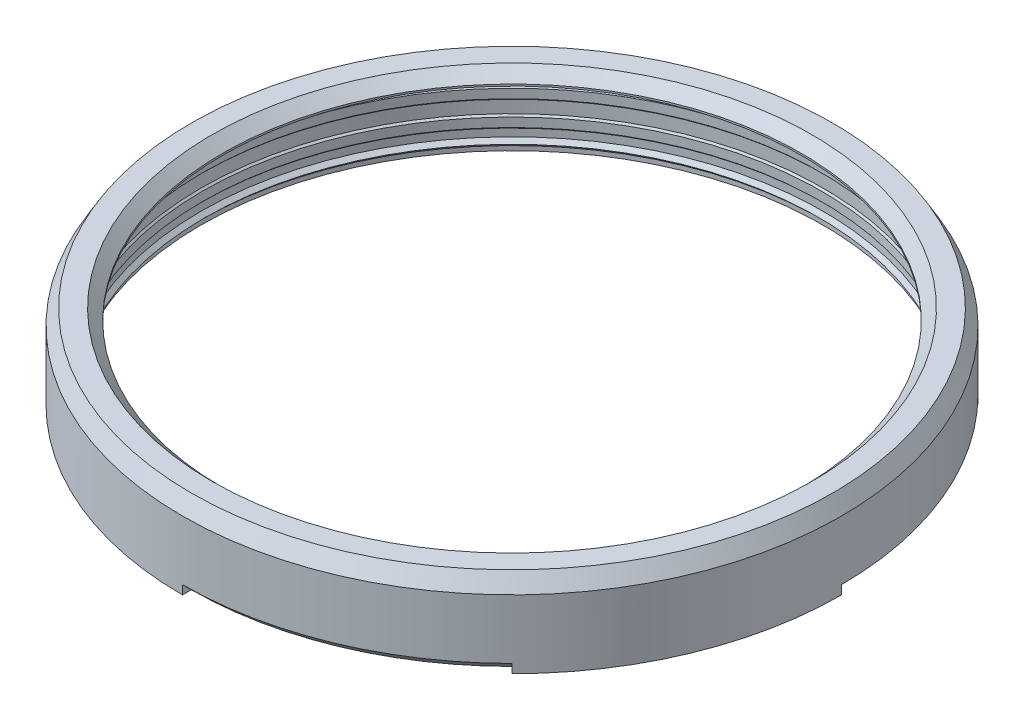
ISO-10303-21;
HEADER;
FILE_DESCRIPTION(('STEP AP214'),'2;1');
FILE_NAME('part.step','',(''),(''),'','','');
FILE_SCHEMA(('AUTOMOTIVE_DESIGN { 1 0 10303 214 1 1 1 1 }'));
ENDSEC;
DATA;
#1=APPLICATION_CONTEXT('core data for automotive mechanical design processes');
#2=APPLICATION_PROTOCOL_DEFINITION('international standard','automotive_design',2000,#1);
#3=PRODUCT_CONTEXT('',#1,'mechanical');
#4=PRODUCT('Part','Part','',(#3));
#5=PRODUCT_RELATED_PRODUCT_CATEGORY('part','',(#4));
#6=PRODUCT_DEFINITION_FORMATION('','',#4);
#7=PRODUCT_DEFINITION_CONTEXT('part definition',#1,'design');
#8=PRODUCT_DEFINITION('design','',#6,#7);
#9=PRODUCT_DEFINITION_SHAPE('','',#8);
#10=(LENGTH_UNIT() NAMED_UNIT(*) SI_UNIT(.MILLI.,.METRE.));
#11=(NAMED_UNIT(*) PLANE_ANGLE_UNIT() SI_UNIT($,.RADIAN.));
#12=(NAMED_UNIT(*) SI_UNIT($,.STERADIAN.) SOLID_ANGLE_UNIT());
#13=UNCERTAINTY_MEASURE_WITH_UNIT(LENGTH_MEASURE(1.E-05),#10,'distance_accuracy_value','');
#14=(GEOMETRIC_REPRESENTATION_CONTEXT(3) GLOBAL_UNCERTAINTY_ASSIGNED_CONTEXT((#13)) GLOBAL_UNIT_ASSIGNED_CONTEXT((#10,
#11,#12)) REPRESENTATION_CONTEXT('',''));
#15=CARTESIAN_POINT('',(0.,0.,0.));
#16=DIRECTION('',(0.,0.,1.));
#17=DIRECTION('',(1.,0.,0.));
#18=AXIS2_PLACEMENT_3D('',#15,#16,#17);
#19=CARTESIAN_POINT('',(0.,-1.39999999999983,0.));
#20=DIRECTION('',(0.,-1.,0.));
#21=DIRECTION('',(1.,0.,0.));
#22=AXIS2_PLACEMENT_3D('',#19,#20,#21);
#23=TOROIDAL_SURFACE('',#22,33.5300000000002,1.39999999999979);
#24=CARTESIAN_POINT('',(0.,-1.39999999999983,0.));
#25=DIRECTION('',(0.,-1.,0.));
#26=DIRECTION('',(1.,0.,0.));
#27=AXIS2_PLACEMENT_3D('',#24,#25,#26);
#28=CIRCLE('',#27,34.93);
#29=CARTESIAN_POINT('',(34.93,-1.39999999999983,0.));
#30=VERTEX_POINT('',#29);
#31=EDGE_CURVE('E261',#30,#30,#28,.T.);
#32=ORIENTED_EDGE('',*,*,#31,.T.);
#33=EDGE_LOOP('',(#32));
#34=FACE_BOUND('',#33,.T.);
#35=CARTESIAN_POINT('',(0.,-0.022502268604415,0.));
#36=DIRECTION('',(0.,-1.,0.));
#37=DIRECTION('',(1.,0.,0.));
#38=AXIS2_PLACEMENT_3D('',#35,#36,#37);
#39=CIRCLE('',#38,33.78);
#40=CARTESIAN_POINT('',(33.78,-0.0225022686044152,0.));
#41=VERTEX_POINT('',#40);
#42=EDGE_CURVE('E43',#41,#41,#39,.F.);
#43=ORIENTED_EDGE('',*,*,#42,.T.);
#44=EDGE_LOOP('',(#43));
#45=FACE_BOUND('',#44,.T.);
#46=ADVANCED_FACE('F38',(#34,#45),#23,.F.);
#47=CARTESIAN_POINT('',(0.,0.,0.));
#48=DIRECTION('',(0.,1.,0.));
#49=DIRECTION('',(0.,0.,1.));
#50=AXIS2_PLACEMENT_3D('',#47,#48,#49);
#51=PLANE('',#50);
#52=CARTESIAN_POINT('',(0.,0.,0.));
#53=DIRECTION('',(0.,1.,0.));
#54=DIRECTION('',(0.,0.,1.));
#55=AXIS2_PLACEMENT_3D('',#52,#53,#54);
#56=CIRCLE('',#55,32.5);
#57=CARTESIAN_POINT('',(0.,0.,32.5));
#58=VERTEX_POINT('',#57);
#59=EDGE_CURVE('E219',#58,#58,#56,.T.);
#60=ORIENTED_EDGE('',*,*,#59,.T.);
#61=EDGE_LOOP('',(#60));
#62=FACE_BOUND('',#61,.T.);
#63=CARTESIAN_POINT('',(0.,0.,0.));
#64=DIRECTION('',(0.,-1.,0.));
#65=DIRECTION('',(0.,0.,-1.));
#66=AXIS2_PLACEMENT_3D('',#63,#64,#65);
#67=CIRCLE('',#66,33.32);
#68=CARTESIAN_POINT('',(0.,0.,-33.32));
#69=VERTEX_POINT('',#68);
#70=EDGE_CURVE('E356',#69,#69,#67,.T.);
#71=ORIENTED_EDGE('',*,*,#70,.T.);
#72=EDGE_LOOP('',(#71));
#73=FACE_BOUND('',#72,.T.);
#74=ADVANCED_FACE('F292',(#62,#73),#51,.F.);
#75=CARTESIAN_POINT('',(0.,2.,0.));
#76=DIRECTION('',(0.,-1.,0.));
#77=DIRECTION('',(0.,0.,-1.));
#78=AXIS2_PLACEMENT_3D('',#75,#76,#77);
#79=CYLINDRICAL_SURFACE('',#78,37.);
#80=CARTESIAN_POINT('',(0.,-0.332000000000053,0.));
#81=DIRECTION('',(0.,1.,0.));
#82=DIRECTION('',(0.,0.,1.));
#83=AXIS2_PLACEMENT_3D('',#80,#81,#82);
#84=CIRCLE('',#83,37.);
#85=CARTESIAN_POINT('',(0.,-0.332000000000053,37.));
#86=VERTEX_POINT('',#85);
#87=EDGE_CURVE('E11',#86,#86,#84,.F.);
#88=ORIENTED_EDGE('',*,*,#87,.T.);
#89=EDGE_LOOP('',(#88));
#90=FACE_BOUND('',#89,.T.);
#91=DIRECTION('',(0.,1.,0.));
#92=VECTOR('',#91,1.);
#93=CARTESIAN_POINT('',(-26.162950903902,-7.99999999999999,-26.1629509039025));
#94=LINE('',#93,#92);
#95=CARTESIAN_POINT('',(-26.162950903902,-7.99999999999999,-26.1629509039025));
#96=VERTEX_POINT('',#95);
#97=CARTESIAN_POINT('',(-26.162950903902,-6.99999999999999,-26.1629509039025));
#98=VERTEX_POINT('',#97);
#99=EDGE_CURVE('E135',#96,#98,#94,.T.);
#100=ORIENTED_EDGE('',*,*,#99,.F.);
#101=CARTESIAN_POINT('',(0.,-7.99999999999999,0.));
#102=DIRECTION('',(0.,-1.,0.));
#103=DIRECTION('',(1.,0.,0.));
#104=AXIS2_PLACEMENT_3D('',#101,#102,#103);
#105=CIRCLE('',#104,36.9999999999999);
#106=CARTESIAN_POINT('',(-36.9999999999999,-7.99999999999999,0.));
#107=VERTEX_POINT('',#106);
#108=EDGE_CURVE('E323',#107,#96,#105,.T.);
#109=ORIENTED_EDGE('',*,*,#108,.F.);
#110=DIRECTION('',(0.,1.,0.));
#111=VECTOR('',#110,1.);
#112=CARTESIAN_POINT('',(-37.,-7.99999999999999,0.));
#113=LINE('',#112,#111);
#114=CARTESIAN_POINT('',(-37.,-6.99999999999999,0.));
#115=VERTEX_POINT('',#114);
#116=EDGE_CURVE('E63',#107,#115,#113,.T.);
#117=ORIENTED_EDGE('',*,*,#116,.T.);
#118=CARTESIAN_POINT('',(0.,-6.99999999999999,0.));
#119=DIRECTION('',(0.,-1.,0.));
#120=DIRECTION('',(0.,0.,1.));
#121=AXIS2_PLACEMENT_3D('',#118,#119,#120);
#122=CIRCLE('',#121,37.);
#123=CARTESIAN_POINT('',(-26.1629509039022,-6.99999999999999,26.1629509039023));
#124=VERTEX_POINT('',#123);
#125=EDGE_CURVE('E143',#124,#115,#122,.T.);
#126=ORIENTED_EDGE('',*,*,#125,.F.);
#127=DIRECTION('',(0.,1.,0.));
#128=VECTOR('',#127,1.);
#129=CARTESIAN_POINT('',(-26.1629509039022,-7.99999999999999,26.1629509039023));
#130=LINE('',#129,#128);
#131=CARTESIAN_POINT('',(-26.1629509039022,-7.99999999999999,26.1629509039023));
#132=VERTEX_POINT('',#131);
#133=EDGE_CURVE('E149',#132,#124,#130,.T.);
#134=ORIENTED_EDGE('',*,*,#133,.F.);
#135=CARTESIAN_POINT('',(-1.2961410730927E-13,-7.99999999999999,36.9999999999999));
#136=VERTEX_POINT('',#135);
#137=EDGE_CURVE('E224',#136,#132,#105,.T.);
#138=ORIENTED_EDGE('',*,*,#137,.F.);
#139=DIRECTION('',(0.,1.,0.));
#140=VECTOR('',#139,1.);
#141=CARTESIAN_POINT('',(-1.29184809537196E-13,-7.99999999999999,37.));
#142=LINE('',#141,#140);
#143=CARTESIAN_POINT('',(-1.29184809537196E-13,-6.99999999999999,37.));
#144=VERTEX_POINT('',#143);
#145=EDGE_CURVE('E181',#136,#144,#142,.T.);
#146=ORIENTED_EDGE('',*,*,#145,.T.);
#147=CARTESIAN_POINT('',(0.,-6.99999999999999,0.));
#148=DIRECTION('',(0.,-1.,0.));
#149=DIRECTION('',(1.,0.,0.));
#150=AXIS2_PLACEMENT_3D('',#147,#148,#149);
#151=CIRCLE('',#150,37.);
#152=CARTESIAN_POINT('',(26.1629509039022,-6.99999999999999,26.1629509039023));
#153=VERTEX_POINT('',#152);
#154=EDGE_CURVE('E186',#153,#144,#151,.T.);
#155=ORIENTED_EDGE('',*,*,#154,.F.);
#156=DIRECTION('',(0.,1.,0.));
#157=VECTOR('',#156,1.);
#158=CARTESIAN_POINT('',(26.1629509039022,-7.99999999999999,26.1629509039023));
#159=LINE('',#158,#157);
#160=CARTESIAN_POINT('',(26.1629509039022,-7.99999999999999,26.1629509039023));
#161=VERTEX_POINT('',#160);
#162=EDGE_CURVE('E194',#161,#153,#159,.T.);
#163=ORIENTED_EDGE('',*,*,#162,.F.);
#164=CARTESIAN_POINT('',(36.9999999999999,-7.99999999999999,0.));
#165=VERTEX_POINT('',#164);
#166=EDGE_CURVE('E220',#165,#161,#105,.T.);
#167=ORIENTED_EDGE('',*,*,#166,.F.);
#168=DIRECTION('',(0.,1.,0.));
#169=VECTOR('',#168,1.);
#170=CARTESIAN_POINT('',(37.,-7.99999999999999,0.));
#171=LINE('',#170,#169);
#172=CARTESIAN_POINT('',(37.,-6.99999999999999,0.));
#173=VERTEX_POINT('',#172);
#174=EDGE_CURVE('E200',#165,#173,#171,.T.);
#175=ORIENTED_EDGE('',*,*,#174,.T.);
#176=CARTESIAN_POINT('',(0.,-6.99999999999999,0.));
#177=DIRECTION('',(0.,-1.,0.));
#178=DIRECTION('',(0.,0.,-1.));
#179=AXIS2_PLACEMENT_3D('',#176,#177,#178);
#180=CIRCLE('',#179,37.);
#181=CARTESIAN_POINT('',(26.1629509039022,-6.99999999999999,-26.1629509039023));
#182=VERTEX_POINT('',#181);
#183=EDGE_CURVE('E217',#182,#173,#180,.T.);
#184=ORIENTED_EDGE('',*,*,#183,.F.);
#185=DIRECTION('',(0.,1.,0.));
#186=VECTOR('',#185,1.);
#187=CARTESIAN_POINT('',(26.1629509039022,-7.99999999999999,-26.1629509039023));
#188=LINE('',#187,#186);
#189=CARTESIAN_POINT('',(26.1629509039022,-7.99999999999999,-26.1629509039023));
#190=VERTEX_POINT('',#189);
#191=EDGE_CURVE('E209',#190,#182,#188,.T.);
#192=ORIENTED_EDGE('',*,*,#191,.F.);
#193=CARTESIAN_POINT('',(3.86266535295363E-13,-7.99999999999999,-36.9999999999999));
#194=VERTEX_POINT('',#193);
#195=EDGE_CURVE('E225',#194,#190,#105,.T.);
#196=ORIENTED_EDGE('',*,*,#195,.F.);
#197=DIRECTION('',(0.,1.,0.));
#198=VECTOR('',#197,1.);
#199=CARTESIAN_POINT('',(3.87554428611588E-13,-7.99999999999999,-37.));
#200=LINE('',#199,#198);
#201=CARTESIAN_POINT('',(3.87554428611588E-13,-6.99999999999999,-37.));
#202=VERTEX_POINT('',#201);
#203=EDGE_CURVE('E55',#194,#202,#200,.T.);
#204=ORIENTED_EDGE('',*,*,#203,.T.);
#205=CARTESIAN_POINT('',(0.,-6.99999999999999,0.));
#206=DIRECTION('',(0.,-1.,0.));
#207=DIRECTION('',(-1.,0.,0.));
#208=AXIS2_PLACEMENT_3D('',#205,#206,#207);
#209=CIRCLE('',#208,37.);
#210=EDGE_CURVE('E166',#98,#202,#209,.T.);
#211=ORIENTED_EDGE('',*,*,#210,.F.);
#212=EDGE_LOOP('',(#100,#109,#117,#126,#134,#138,#146,#155,#163,#167,#175,#184,#192,#196,#204,#211));
#213=FACE_BOUND('',#212,.T.);
#214=ADVANCED_FACE('F300',(#90,#213),#79,.T.);
#215=CARTESIAN_POINT('',(21.7480543348214,-7.99999999999999,-29.9336287918731));
#216=DIRECTION('',(0.,-1.,0.));
#217=DIRECTION('',(1.,0.,0.));
#218=AXIS2_PLACEMENT_3D('',#215,#216,#217);
#219=PLANE('',#218);
#220=CARTESIAN_POINT('',(0.,-7.99999999999999,0.));
#221=DIRECTION('',(0.,-1.,0.));
#222=DIRECTION('',(1.,0.,0.));
#223=AXIS2_PLACEMENT_3D('',#220,#221,#222);
#224=CIRCLE('',#223,34.93);
#225=CARTESIAN_POINT('',(34.93,-7.99999999999999,0.));
#226=VERTEX_POINT('',#225);
#227=EDGE_CURVE('E223',#226,#226,#224,.T.);
#228=ORIENTED_EDGE('',*,*,#227,.F.);
#229=EDGE_LOOP('',(#228));
#230=FACE_BOUND('',#229,.T.);
#231=ORIENTED_EDGE('',*,*,#108,.T.);
#232=DIRECTION('',(-0.707106781186541,0.,-0.707106781186554));
#233=VECTOR('',#232,1.);
#234=CARTESIAN_POINT('',(-25.4558441227155,-8.,-25.4558441227159));
#235=LINE('',#234,#233);
#236=CARTESIAN_POINT('',(-25.4558441227155,-8.,-25.4558441227159));
#237=VERTEX_POINT('',#236);
#238=EDGE_CURVE('E172',#237,#96,#235,.T.);
#239=ORIENTED_EDGE('',*,*,#238,.F.);
#240=CARTESIAN_POINT('',(0.,-8.,0.));
#241=DIRECTION('',(0.,-1.,0.));
#242=DIRECTION('',(-1.,0.,0.));
#243=AXIS2_PLACEMENT_3D('',#240,#241,#242);
#244=CIRCLE('',#243,36.);
#245=CARTESIAN_POINT('',(3.77079984595058E-13,-8.,-36.));
#246=VERTEX_POINT('',#245);
#247=EDGE_CURVE('E169',#237,#246,#244,.T.);
#248=ORIENTED_EDGE('',*,*,#247,.T.);
#249=DIRECTION('',(0.,0.,-1.));
#250=VECTOR('',#249,1.);
#251=CARTESIAN_POINT('',(3.77079984595058E-13,-8.,-36.));
#252=LINE('',#251,#250);
#253=EDGE_CURVE('E158',#246,#194,#252,.T.);
#254=ORIENTED_EDGE('',*,*,#253,.T.);
#255=ORIENTED_EDGE('',*,*,#195,.T.);
#256=DIRECTION('',(0.707106781186546,0.,-0.707106781186549));
#257=VECTOR('',#256,1.);
#258=CARTESIAN_POINT('',(25.4558441227157,-8.,-25.4558441227158));
#259=LINE('',#258,#257);
#260=CARTESIAN_POINT('',(25.4558441227157,-8.,-25.4558441227158));
#261=VERTEX_POINT('',#260);
#262=EDGE_CURVE('E206',#261,#190,#259,.T.);
#263=ORIENTED_EDGE('',*,*,#262,.F.);
#264=CARTESIAN_POINT('',(0.,-8.,0.));
#265=DIRECTION('',(0.,-1.,0.));
#266=DIRECTION('',(0.,0.,-1.));
#267=AXIS2_PLACEMENT_3D('',#264,#265,#266);
#268=CIRCLE('',#267,36.);
#269=CARTESIAN_POINT('',(36.,-8.,0.));
#270=VERTEX_POINT('',#269);
#271=EDGE_CURVE('E214',#261,#270,#268,.T.);
#272=ORIENTED_EDGE('',*,*,#271,.T.);
#273=DIRECTION('',(1.,0.,0.));
#274=VECTOR('',#273,1.);
#275=CARTESIAN_POINT('',(36.,-8.,0.));
#276=LINE('',#275,#274);
#277=EDGE_CURVE('E197',#270,#165,#276,.T.);
#278=ORIENTED_EDGE('',*,*,#277,.T.);
#279=ORIENTED_EDGE('',*,*,#166,.T.);
#280=DIRECTION('',(0.707106781186546,0.,0.707106781186549));
#281=VECTOR('',#280,1.);
#282=CARTESIAN_POINT('',(25.4558441227157,-8.,25.4558441227158));
#283=LINE('',#282,#281);
#284=CARTESIAN_POINT('',(25.4558441227157,-8.,25.4558441227158));
#285=VERTEX_POINT('',#284);
#286=EDGE_CURVE('E192',#285,#161,#283,.T.);
#287=ORIENTED_EDGE('',*,*,#286,.F.);
#288=CARTESIAN_POINT('',(0.,-8.,0.));
#289=DIRECTION('',(0.,-1.,0.));
#290=DIRECTION('',(1.,0.,0.));
#291=AXIS2_PLACEMENT_3D('',#288,#289,#290);
#292=CIRCLE('',#291,36.);
#293=CARTESIAN_POINT('',(-1.25693328198353E-13,-8.,36.));
#294=VERTEX_POINT('',#293);
#295=EDGE_CURVE('E189',#285,#294,#292,.T.);
#296=ORIENTED_EDGE('',*,*,#295,.T.);
#297=DIRECTION('',(0.,0.,1.));
#298=VECTOR('',#297,1.);
#299=CARTESIAN_POINT('',(-1.25693328198353E-13,-8.,36.));
#300=LINE('',#299,#298);
#301=EDGE_CURVE('E157',#294,#136,#300,.T.);
#302=ORIENTED_EDGE('',*,*,#301,.T.);
#303=ORIENTED_EDGE('',*,*,#137,.T.);
#304=DIRECTION('',(-0.707106781186546,0.,0.707106781186549));
#305=VECTOR('',#304,1.);
#306=CARTESIAN_POINT('',(-25.4558441227157,-8.,25.4558441227158));
#307=LINE('',#306,#305);
#308=CARTESIAN_POINT('',(-25.4558441227157,-8.,25.4558441227158));
#309=VERTEX_POINT('',#308);
#310=EDGE_CURVE('E147',#309,#132,#307,.T.);
#311=ORIENTED_EDGE('',*,*,#310,.F.);
#312=CARTESIAN_POINT('',(0.,-8.,0.));
#313=DIRECTION('',(0.,-1.,0.));
#314=DIRECTION('',(0.,0.,1.));
#315=AXIS2_PLACEMENT_3D('',#312,#313,#314);
#316=CIRCLE('',#315,36.);
#317=CARTESIAN_POINT('',(-36.,-8.,0.));
#318=VERTEX_POINT('',#317);
#319=EDGE_CURVE('E140',#309,#318,#316,.T.);
#320=ORIENTED_EDGE('',*,*,#319,.T.);
#321=DIRECTION('',(-1.,0.,0.));
#322=VECTOR('',#321,1.);
#323=CARTESIAN_POINT('',(-36.,-8.,0.));
#324=LINE('',#323,#322);
#325=EDGE_CURVE('E126',#318,#107,#324,.T.);
#326=ORIENTED_EDGE('',*,*,#325,.T.);
#327=EDGE_LOOP('',(#231,#239,#248,#254,#255,#263,#272,#278,#279,#287,#296,#302,#303,#311,#320,#326));
#328=FACE_BOUND('',#327,.T.);
#329=ADVANCED_FACE('F145',(#230,#328),#219,.T.);
#330=CARTESIAN_POINT('',(0.,-7.99999999999999,0.));
#331=DIRECTION('',(0.,1.,0.));
#332=DIRECTION('',(0.,0.,1.));
#333=AXIS2_PLACEMENT_3D('',#330,#331,#332);
#334=CYLINDRICAL_SURFACE('',#333,32.5);
#335=CARTESIAN_POINT('',(0.,0.199999999999987,0.));
#336=DIRECTION('',(0.,1.,0.));
#337=DIRECTION('',(0.,0.,1.));
#338=AXIS2_PLACEMENT_3D('',#335,#336,#337);
#339=CIRCLE('',#338,32.5);
#340=CARTESIAN_POINT('',(0.,0.199999999999987,32.5));
#341=VERTEX_POINT('',#340);
#342=EDGE_CURVE('E269',#341,#341,#339,.T.);
#343=ORIENTED_EDGE('',*,*,#342,.T.);
#344=EDGE_LOOP('',(#343));
#345=FACE_BOUND('',#344,.T.);
#346=ORIENTED_EDGE('',*,*,#59,.F.);
#347=EDGE_LOOP('',(#346));
#348=FACE_BOUND('',#347,.T.);
#349=ADVANCED_FACE('F317',(#345,#348),#334,.F.);
#350=CARTESIAN_POINT('',(0.,0.,0.));
#351=DIRECTION('',(0.,-1.,0.));
#352=DIRECTION('',(1.,0.,0.));
#353=AXIS2_PLACEMENT_3D('',#350,#351,#352);
#354=CYLINDRICAL_SURFACE('',#353,34.93);
#355=CARTESIAN_POINT('',(0.,-1.59999999999961,0.));
#356=DIRECTION('',(0.,-1.,0.));
#357=DIRECTION('',(1.,0.,0.));
#358=AXIS2_PLACEMENT_3D('',#355,#356,#357);
#359=CIRCLE('',#358,34.93);
#360=CARTESIAN_POINT('',(34.93,-1.59999999999961,0.));
#361=VERTEX_POINT('',#360);
#362=EDGE_CURVE('E258',#361,#361,#359,.T.);
#363=ORIENTED_EDGE('',*,*,#362,.T.);
#364=EDGE_LOOP('',(#363));
#365=FACE_BOUND('',#364,.T.);
#366=ORIENTED_EDGE('',*,*,#31,.F.);
#367=EDGE_LOOP('',(#366));
#368=FACE_BOUND('',#367,.T.);
#369=ADVANCED_FACE('F305',(#365,#368),#354,.F.);
#370=CARTESIAN_POINT('',(0.,-1.59999999999961,0.));
#371=DIRECTION('',(0.,1.,0.));
#372=DIRECTION('',(-1.,0.,0.));
#373=AXIS2_PLACEMENT_3D('',#370,#371,#372);
#374=CONICAL_SURFACE('',#373,34.93,0.78539816339743);
#375=CARTESIAN_POINT('',(0.,-1.78999999999964,0.));
#376=DIRECTION('',(0.,-1.,0.));
#377=DIRECTION('',(1.,0.,0.));
#378=AXIS2_PLACEMENT_3D('',#375,#376,#377);
#379=CIRCLE('',#378,34.74);
#380=CARTESIAN_POINT('',(34.74,-1.78999999999964,0.));
#381=VERTEX_POINT('',#380);
#382=EDGE_CURVE('E255',#381,#381,#379,.T.);
#383=ORIENTED_EDGE('',*,*,#382,.T.);
#384=EDGE_LOOP('',(#383));
#385=FACE_BOUND('',#384,.T.);
#386=ORIENTED_EDGE('',*,*,#362,.F.);
#387=EDGE_LOOP('',(#386));
#388=FACE_BOUND('',#387,.T.);
#389=ADVANCED_FACE('F446',(#385,#388),#374,.F.);
#390=CARTESIAN_POINT('',(0.,0.,0.));
#391=DIRECTION('',(0.,-1.,0.));
#392=DIRECTION('',(1.,0.,0.));
#393=AXIS2_PLACEMENT_3D('',#390,#391,#392);
#394=CYLINDRICAL_SURFACE('',#393,34.74);
#395=CARTESIAN_POINT('',(0.,-2.80999999999965,0.));
#396=DIRECTION('',(0.,-1.,0.));
#397=DIRECTION('',(1.,0.,0.));
#398=AXIS2_PLACEMENT_3D('',#395,#396,#397);
#399=CIRCLE('',#398,34.74);
#400=CARTESIAN_POINT('',(34.74,-2.80999999999965,0.));
#401=VERTEX_POINT('',#400);
#402=EDGE_CURVE('E252',#401,#401,#399,.T.);
#403=ORIENTED_EDGE('',*,*,#402,.T.);
#404=EDGE_LOOP('',(#403));
#405=FACE_BOUND('',#404,.T.);
#406=ORIENTED_EDGE('',*,*,#382,.F.);
#407=EDGE_LOOP('',(#406));
#408=FACE_BOUND('',#407,.T.);
#409=ADVANCED_FACE('F443',(#405,#408),#394,.F.);
#410=CARTESIAN_POINT('',(0.,-2.80999999999965,0.));
#411=DIRECTION('',(0.,-1.,0.));
#412=DIRECTION('',(1.,0.,0.));
#413=AXIS2_PLACEMENT_3D('',#410,#411,#412);
#414=CONICAL_SURFACE('',#413,34.74,0.785398163397524);
#415=CARTESIAN_POINT('',(0.,-2.99999999999965,0.));
#416=DIRECTION('',(0.,-1.,0.));
#417=DIRECTION('',(1.,0.,0.));
#418=AXIS2_PLACEMENT_3D('',#415,#416,#417);
#419=CIRCLE('',#418,34.93);
#420=CARTESIAN_POINT('',(34.93,-2.99999999999965,0.));
#421=VERTEX_POINT('',#420);
#422=EDGE_CURVE('E249',#421,#421,#419,.T.);
#423=ORIENTED_EDGE('',*,*,#422,.T.);
#424=EDGE_LOOP('',(#423));
#425=FACE_BOUND('',#424,.T.);
#426=ORIENTED_EDGE('',*,*,#402,.F.);
#427=EDGE_LOOP('',(#426));
#428=FACE_BOUND('',#427,.T.);
#429=ADVANCED_FACE('F439',(#425,#428),#414,.F.);
#430=CARTESIAN_POINT('',(0.,0.,0.));
#431=DIRECTION('',(0.,-1.,0.));
#432=DIRECTION('',(1.,0.,0.));
#433=AXIS2_PLACEMENT_3D('',#430,#431,#432);
#434=CYLINDRICAL_SURFACE('',#433,34.93);
#435=CARTESIAN_POINT('',(0.,-4.39999999999964,0.));
#436=DIRECTION('',(0.,-1.,0.));
#437=DIRECTION('',(1.,0.,0.));
#438=AXIS2_PLACEMENT_3D('',#435,#436,#437);
#439=CIRCLE('',#438,34.93);
#440=CARTESIAN_POINT('',(34.93,-4.39999999999964,0.));
#441=VERTEX_POINT('',#440);
#442=EDGE_CURVE('E246',#441,#441,#439,.T.);
#443=ORIENTED_EDGE('',*,*,#442,.T.);
#444=EDGE_LOOP('',(#443));
#445=FACE_BOUND('',#444,.T.);
#446=ORIENTED_EDGE('',*,*,#422,.F.);
#447=EDGE_LOOP('',(#446));
#448=FACE_BOUND('',#447,.T.);
#449=ADVANCED_FACE('F435',(#445,#448),#434,.F.);
#450=CARTESIAN_POINT('',(0.,-4.39999999999964,0.));
#451=DIRECTION('',(0.,1.,0.));
#452=DIRECTION('',(-1.,0.,0.));
#453=AXIS2_PLACEMENT_3D('',#450,#451,#452);
#454=CONICAL_SURFACE('',#453,34.93,0.785398163397394);
#455=CARTESIAN_POINT('',(0.,-4.58999999999968,0.));
#456=DIRECTION('',(0.,-1.,0.));
#457=DIRECTION('',(1.,0.,0.));
#458=AXIS2_PLACEMENT_3D('',#455,#456,#457);
#459=CIRCLE('',#458,34.74);
#460=CARTESIAN_POINT('',(34.74,-4.58999999999968,0.));
#461=VERTEX_POINT('',#460);
#462=EDGE_CURVE('E243',#461,#461,#459,.T.);
#463=ORIENTED_EDGE('',*,*,#462,.T.);
#464=EDGE_LOOP('',(#463));
#465=FACE_BOUND('',#464,.T.);
#466=ORIENTED_EDGE('',*,*,#442,.F.);
#467=EDGE_LOOP('',(#466));
#468=FACE_BOUND('',#467,.T.);
#469=ADVANCED_FACE('F431',(#465,#468),#454,.F.);
#470=CARTESIAN_POINT('',(0.,0.,0.));
#471=DIRECTION('',(0.,-1.,0.));
#472=DIRECTION('',(1.,0.,0.));
#473=AXIS2_PLACEMENT_3D('',#470,#471,#472);
#474=CYLINDRICAL_SURFACE('',#473,34.74);
#475=CARTESIAN_POINT('',(0.,-5.60999999999964,0.));
#476=DIRECTION('',(0.,-1.,0.));
#477=DIRECTION('',(1.,0.,0.));
#478=AXIS2_PLACEMENT_3D('',#475,#476,#477);
#479=CIRCLE('',#478,34.74);
#480=CARTESIAN_POINT('',(34.74,-5.60999999999964,0.));
#481=VERTEX_POINT('',#480);
#482=EDGE_CURVE('E240',#481,#481,#479,.T.);
#483=ORIENTED_EDGE('',*,*,#482,.T.);
#484=EDGE_LOOP('',(#483));
#485=FACE_BOUND('',#484,.T.);
#486=ORIENTED_EDGE('',*,*,#462,.F.);
#487=EDGE_LOOP('',(#486));
#488=FACE_BOUND('',#487,.T.);
#489=ADVANCED_FACE('F427',(#485,#488),#474,.F.);
#490=CARTESIAN_POINT('',(0.,-5.60999999999964,0.));
#491=DIRECTION('',(0.,-1.,0.));
#492=DIRECTION('',(1.,0.,0.));
#493=AXIS2_PLACEMENT_3D('',#490,#491,#492);
#494=CONICAL_SURFACE('',#493,34.74,0.785398163397521);
#495=CARTESIAN_POINT('',(0.,-5.79999999999963,0.));
#496=DIRECTION('',(0.,-1.,0.));
#497=DIRECTION('',(1.,0.,0.));
#498=AXIS2_PLACEMENT_3D('',#495,#496,#497);
#499=CIRCLE('',#498,34.93);
#500=CARTESIAN_POINT('',(34.93,-5.79999999999963,0.));
#501=VERTEX_POINT('',#500);
#502=EDGE_CURVE('E237',#501,#501,#499,.T.);
#503=ORIENTED_EDGE('',*,*,#502,.T.);
#504=EDGE_LOOP('',(#503));
#505=FACE_BOUND('',#504,.T.);
#506=ORIENTED_EDGE('',*,*,#482,.F.);
#507=EDGE_LOOP('',(#506));
#508=FACE_BOUND('',#507,.T.);
#509=ADVANCED_FACE('F423',(#505,#508),#494,.F.);
#510=CARTESIAN_POINT('',(0.,0.,0.));
#511=DIRECTION('',(0.,-1.,0.));
#512=DIRECTION('',(1.,0.,0.));
#513=AXIS2_PLACEMENT_3D('',#510,#511,#512);
#514=CYLINDRICAL_SURFACE('',#513,34.93);
#515=CARTESIAN_POINT('',(0.,-6.64999999999963,0.));
#516=DIRECTION('',(0.,-1.,0.));
#517=DIRECTION('',(1.,0.,0.));
#518=AXIS2_PLACEMENT_3D('',#515,#516,#517);
#519=CIRCLE('',#518,34.93);
#520=CARTESIAN_POINT('',(34.93,-6.64999999999963,0.));
#521=VERTEX_POINT('',#520);
#522=EDGE_CURVE('E234',#521,#521,#519,.T.);
#523=ORIENTED_EDGE('',*,*,#522,.T.);
#524=EDGE_LOOP('',(#523));
#525=FACE_BOUND('',#524,.T.);
#526=ORIENTED_EDGE('',*,*,#502,.F.);
#527=EDGE_LOOP('',(#526));
#528=FACE_BOUND('',#527,.T.);
#529=ADVANCED_FACE('F419',(#525,#528),#514,.F.);
#530=CARTESIAN_POINT('',(0.,-6.64999999999963,0.));
#531=DIRECTION('',(0.,1.,0.));
#532=DIRECTION('',(-1.,0.,0.));
#533=AXIS2_PLACEMENT_3D('',#530,#531,#532);
#534=CONICAL_SURFACE('',#533,34.93,0.785398163397395);
#535=CARTESIAN_POINT('',(0.,-7.07499999999985,0.));
#536=DIRECTION('',(0.,-1.,0.));
#537=DIRECTION('',(1.,0.,0.));
#538=AXIS2_PLACEMENT_3D('',#535,#536,#537);
#539=CIRCLE('',#538,34.5049999999998);
#540=CARTESIAN_POINT('',(34.5049999999998,-7.07499999999985,0.));
#541=VERTEX_POINT('',#540);
#542=EDGE_CURVE('E231',#541,#541,#539,.T.);
#543=ORIENTED_EDGE('',*,*,#542,.T.);
#544=EDGE_LOOP('',(#543));
#545=FACE_BOUND('',#544,.T.);
#546=ORIENTED_EDGE('',*,*,#522,.F.);
#547=EDGE_LOOP('',(#546));
#548=FACE_BOUND('',#547,.T.);
#549=ADVANCED_FACE('F415',(#545,#548),#534,.F.);
#550=CARTESIAN_POINT('',(0.,-7.07499999999985,0.));
#551=DIRECTION('',(0.,-1.,0.));
#552=DIRECTION('',(1.,0.,0.));
#553=AXIS2_PLACEMENT_3D('',#550,#551,#552);
#554=CONICAL_SURFACE('',#553,34.5049999999998,0.785398163397503);
#555=CARTESIAN_POINT('',(0.,-7.49999999999998,0.));
#556=DIRECTION('',(0.,-1.,0.));
#557=DIRECTION('',(1.,0.,0.));
#558=AXIS2_PLACEMENT_3D('',#555,#556,#557);
#559=CIRCLE('',#558,34.93);
#560=CARTESIAN_POINT('',(34.93,-7.49999999999998,0.));
#561=VERTEX_POINT('',#560);
#562=EDGE_CURVE('E228',#561,#561,#559,.T.);
#563=ORIENTED_EDGE('',*,*,#562,.T.);
#564=EDGE_LOOP('',(#563));
#565=FACE_BOUND('',#564,.T.);
#566=ORIENTED_EDGE('',*,*,#542,.F.);
#567=EDGE_LOOP('',(#566));
#568=FACE_BOUND('',#567,.T.);
#569=ADVANCED_FACE('F411',(#565,#568),#554,.F.);
#570=CARTESIAN_POINT('',(0.,0.,0.));
#571=DIRECTION('',(0.,-1.,0.));
#572=DIRECTION('',(1.,0.,0.));
#573=AXIS2_PLACEMENT_3D('',#570,#571,#572);
#574=CYLINDRICAL_SURFACE('',#573,34.93);
#575=ORIENTED_EDGE('',*,*,#227,.T.);
#576=EDGE_LOOP('',(#575));
#577=FACE_BOUND('',#576,.T.);
#578=ORIENTED_EDGE('',*,*,#562,.F.);
#579=EDGE_LOOP('',(#578));
#580=FACE_BOUND('',#579,.T.);
#581=ADVANCED_FACE('F405',(#577,#580),#574,.F.);
#582=CARTESIAN_POINT('',(0.,1.4,0.));
#583=DIRECTION('',(0.,1.,0.));
#584=DIRECTION('',(0.,0.,1.));
#585=AXIS2_PLACEMENT_3D('',#582,#583,#584);
#586=PLANE('',#585);
#587=CARTESIAN_POINT('',(0.,1.4,0.));
#588=DIRECTION('',(0.,1.,0.));
#589=DIRECTION('',(0.,0.,1.));
#590=AXIS2_PLACEMENT_3D('',#587,#588,#589);
#591=CIRCLE('',#590,36.0000293337636);
#592=CARTESIAN_POINT('',(0.,1.4,36.0000293337636));
#593=VERTEX_POINT('',#592);
#594=EDGE_CURVE('E48',#593,#593,#591,.T.);
#595=ORIENTED_EDGE('',*,*,#594,.T.);
#596=EDGE_LOOP('',(#595));
#597=FACE_BOUND('',#596,.T.);
#598=CARTESIAN_POINT('',(0.,1.4,0.));
#599=DIRECTION('',(0.,1.,0.));
#600=DIRECTION('',(0.,0.,1.));
#601=AXIS2_PLACEMENT_3D('',#598,#599,#600);
#602=CIRCLE('',#601,33.7);
#603=CARTESIAN_POINT('',(0.,1.4,33.7));
#604=VERTEX_POINT('',#603);
#605=EDGE_CURVE('E264',#604,#604,#602,.F.);
#606=ORIENTED_EDGE('',*,*,#605,.T.);
#607=EDGE_LOOP('',(#606));
#608=FACE_BOUND('',#607,.T.);
#609=ADVANCED_FACE('F275',(#597,#608),#586,.T.);
#610=CARTESIAN_POINT('',(0.,1.4,0.));
#611=DIRECTION('',(0.,1.,0.));
#612=DIRECTION('',(0.,0.,1.));
#613=AXIS2_PLACEMENT_3D('',#610,#611,#612);
#614=CONICAL_SURFACE('',#613,33.7,0.785398163397448);
#615=ORIENTED_EDGE('',*,*,#342,.F.);
#616=EDGE_LOOP('',(#615));
#617=FACE_BOUND('',#616,.T.);
#618=ORIENTED_EDGE('',*,*,#605,.F.);
#619=EDGE_LOOP('',(#618));
#620=FACE_BOUND('',#619,.T.);
#621=ADVANCED_FACE('F280',(#617,#620),#614,.F.);
#622=CARTESIAN_POINT('',(0.,1.4,0.));
#623=DIRECTION('',(0.,-1.,0.));
#624=DIRECTION('',(0.,0.,-1.));
#625=AXIS2_PLACEMENT_3D('',#622,#623,#624);
#626=CONICAL_SURFACE('',#625,36.0000293337636,0.523598775598291);
#627=ORIENTED_EDGE('',*,*,#87,.F.);
#628=EDGE_LOOP('',(#627));
#629=FACE_BOUND('',#628,.T.);
#630=ORIENTED_EDGE('',*,*,#594,.F.);
#631=EDGE_LOOP('',(#630));
#632=FACE_BOUND('',#631,.T.);
#633=ADVANCED_FACE('F41',(#629,#632),#626,.T.);
#634=CARTESIAN_POINT('',(0.,-6.99999999999999,0.));
#635=DIRECTION('',(0.,1.,0.));
#636=DIRECTION('',(0.,0.,1.));
#637=AXIS2_PLACEMENT_3D('',#634,#635,#636);
#638=CONICAL_SURFACE('',#637,37.,0.785398163397441);
#639=DIRECTION('',(-0.499999999999997,-0.70710678118655,0.499999999999999));
#640=VECTOR('',#639,1.);
#641=CARTESIAN_POINT('',(26.1629509039022,-6.99999999999999,-26.1629509039023));
#642=LINE('',#641,#640);
#643=EDGE_CURVE('E211',#182,#261,#642,.T.);
#644=ORIENTED_EDGE('',*,*,#643,.F.);
#645=ORIENTED_EDGE('',*,*,#183,.T.);
#646=DIRECTION('',(-0.707106781186545,-0.70710678118655,0.));
#647=VECTOR('',#646,1.);
#648=CARTESIAN_POINT('',(37.,-6.99999999999999,0.));
#649=LINE('',#648,#647);
#650=EDGE_CURVE('E203',#173,#270,#649,.T.);
#651=ORIENTED_EDGE('',*,*,#650,.T.);
#652=ORIENTED_EDGE('',*,*,#271,.F.);
#653=EDGE_LOOP('',(#644,#645,#651,#652));
#654=FACE_BOUND('',#653,.T.);
#655=ADVANCED_FACE('F279',(#654),#638,.T.);
#656=CARTESIAN_POINT('',(0.,0.,0.));
#657=DIRECTION('',(0.707106781186549,0.,0.707106781186546));
#658=DIRECTION('',(0.707106781186546,0.,-0.707106781186549));
#659=AXIS2_PLACEMENT_3D('',#656,#657,#658);
#660=PLANE('',#659);
#661=ORIENTED_EDGE('',*,*,#262,.T.);
#662=ORIENTED_EDGE('',*,*,#191,.T.);
#663=ORIENTED_EDGE('',*,*,#643,.T.);
#664=EDGE_LOOP('',(#661,#662,#663));
#665=FACE_BOUND('',#664,.T.);
#666=ADVANCED_FACE('F286',(#665),#660,.T.);
#667=CARTESIAN_POINT('',(0.,0.,0.));
#668=DIRECTION('',(0.,0.,1.));
#669=DIRECTION('',(1.,0.,0.));
#670=AXIS2_PLACEMENT_3D('',#667,#668,#669);
#671=PLANE('',#670);
#672=ORIENTED_EDGE('',*,*,#277,.F.);
#673=ORIENTED_EDGE('',*,*,#650,.F.);
#674=ORIENTED_EDGE('',*,*,#174,.F.);
#675=EDGE_LOOP('',(#672,#673,#674));
#676=FACE_BOUND('',#675,.T.);
#677=ADVANCED_FACE('F335',(#676),#671,.F.);
#678=CARTESIAN_POINT('',(0.,0.,0.));
#679=DIRECTION('',(-0.707106781186549,0.,0.707106781186546));
#680=DIRECTION('',(0.707106781186546,0.,0.707106781186549));
#681=AXIS2_PLACEMENT_3D('',#678,#679,#680);
#682=PLANE('',#681);
#683=ORIENTED_EDGE('',*,*,#286,.T.);
#684=ORIENTED_EDGE('',*,*,#162,.T.);
#685=DIRECTION('',(-0.499999999999997,-0.70710678118655,-0.499999999999999));
#686=VECTOR('',#685,1.);
#687=CARTESIAN_POINT('',(26.1629509039022,-6.99999999999999,26.1629509039023));
#688=LINE('',#687,#686);
#689=EDGE_CURVE('E184',#153,#285,#688,.T.);
#690=ORIENTED_EDGE('',*,*,#689,.T.);
#691=EDGE_LOOP('',(#683,#684,#690));
#692=FACE_BOUND('',#691,.T.);
#693=ADVANCED_FACE('F340',(#692),#682,.T.);
#694=CARTESIAN_POINT('',(0.,-6.99999999999999,0.));
#695=DIRECTION('',(0.,1.,0.));
#696=DIRECTION('',(-1.,0.,0.));
#697=AXIS2_PLACEMENT_3D('',#694,#695,#696);
#698=CONICAL_SURFACE('',#697,37.,0.785398163397441);
#699=ORIENTED_EDGE('',*,*,#689,.F.);
#700=ORIENTED_EDGE('',*,*,#154,.T.);
#701=DIRECTION('',(0.,-0.70710678118655,-0.707106781186545));
#702=VECTOR('',#701,1.);
#703=CARTESIAN_POINT('',(-1.29184809537196E-13,-6.99999999999999,37.));
#704=LINE('',#703,#702);
#705=EDGE_CURVE('E178',#144,#294,#704,.T.);
#706=ORIENTED_EDGE('',*,*,#705,.T.);
#707=ORIENTED_EDGE('',*,*,#295,.F.);
#708=EDGE_LOOP('',(#699,#700,#706,#707));
#709=FACE_BOUND('',#708,.T.);
#710=ADVANCED_FACE('F344',(#709),#698,.T.);
#711=CARTESIAN_POINT('',(0.,0.,0.));
#712=DIRECTION('',(-1.,0.,0.));
#713=DIRECTION('',(0.,0.,1.));
#714=AXIS2_PLACEMENT_3D('',#711,#712,#713);
#715=PLANE('',#714);
#716=ORIENTED_EDGE('',*,*,#301,.F.);
#717=ORIENTED_EDGE('',*,*,#705,.F.);
#718=ORIENTED_EDGE('',*,*,#145,.F.);
#719=EDGE_LOOP('',(#716,#717,#718));
#720=FACE_BOUND('',#719,.T.);
#721=ADVANCED_FACE('F346',(#720),#715,.F.);
#722=CARTESIAN_POINT('',(0.,0.,0.));
#723=DIRECTION('',(-0.707106781186549,0.,-0.707106781186546));
#724=DIRECTION('',(-0.707106781186546,0.,0.707106781186549));
#725=AXIS2_PLACEMENT_3D('',#722,#723,#724);
#726=PLANE('',#725);
#727=ORIENTED_EDGE('',*,*,#310,.T.);
#728=ORIENTED_EDGE('',*,*,#133,.T.);
#729=DIRECTION('',(0.499999999999997,-0.70710678118655,-0.499999999999999));
#730=VECTOR('',#729,1.);
#731=CARTESIAN_POINT('',(-26.1629509039022,-6.99999999999999,26.1629509039023));
#732=LINE('',#731,#730);
#733=EDGE_CURVE('E151',#124,#309,#732,.T.);
#734=ORIENTED_EDGE('',*,*,#733,.T.);
#735=EDGE_LOOP('',(#727,#728,#734));
#736=FACE_BOUND('',#735,.T.);
#737=ADVANCED_FACE('F349',(#736),#726,.T.);
#738=CARTESIAN_POINT('',(0.,-6.99999999999999,0.));
#739=DIRECTION('',(0.,1.,0.));
#740=DIRECTION('',(0.,0.,-1.));
#741=AXIS2_PLACEMENT_3D('',#738,#739,#740);
#742=CONICAL_SURFACE('',#741,37.,0.785398163397441);
#743=ORIENTED_EDGE('',*,*,#733,.F.);
#744=ORIENTED_EDGE('',*,*,#125,.T.);
#745=DIRECTION('',(0.707106781186545,-0.70710678118655,0.));
#746=VECTOR('',#745,1.);
#747=CARTESIAN_POINT('',(-37.,-6.99999999999999,0.));
#748=LINE('',#747,#746);
#749=EDGE_CURVE('E129',#115,#318,#748,.T.);
#750=ORIENTED_EDGE('',*,*,#749,.T.);
#751=ORIENTED_EDGE('',*,*,#319,.F.);
#752=EDGE_LOOP('',(#743,#744,#750,#751));
#753=FACE_BOUND('',#752,.T.);
#754=ADVANCED_FACE('F139',(#753),#742,.T.);
#755=CARTESIAN_POINT('',(0.,0.,0.));
#756=DIRECTION('',(0.,0.,-1.));
#757=DIRECTION('',(-1.,0.,0.));
#758=AXIS2_PLACEMENT_3D('',#755,#756,#757);
#759=PLANE('',#758);
#760=ORIENTED_EDGE('',*,*,#325,.F.);
#761=ORIENTED_EDGE('',*,*,#749,.F.);
#762=ORIENTED_EDGE('',*,*,#116,.F.);
#763=EDGE_LOOP('',(#760,#761,#762));
#764=FACE_BOUND('',#763,.T.);
#765=ADVANCED_FACE('F128',(#764),#759,.F.);
#766=CARTESIAN_POINT('',(0.,0.,0.));
#767=DIRECTION('',(0.707106781186554,0.,-0.707106781186541));
#768=DIRECTION('',(-0.707106781186541,0.,-0.707106781186554));
#769=AXIS2_PLACEMENT_3D('',#766,#767,#768);
#770=PLANE('',#769);
#771=ORIENTED_EDGE('',*,*,#238,.T.);
#772=ORIENTED_EDGE('',*,*,#99,.T.);
#773=DIRECTION('',(0.499999999999994,-0.70710678118655,0.500000000000002));
#774=VECTOR('',#773,1.);
#775=CARTESIAN_POINT('',(-26.162950903902,-6.99999999999999,-26.1629509039025));
#776=LINE('',#775,#774);
#777=EDGE_CURVE('E164',#98,#237,#776,.T.);
#778=ORIENTED_EDGE('',*,*,#777,.T.);
#779=EDGE_LOOP('',(#771,#772,#778));
#780=FACE_BOUND('',#779,.T.);
#781=ADVANCED_FACE('F383',(#780),#770,.T.);
#782=CARTESIAN_POINT('',(0.,-6.99999999999999,0.));
#783=DIRECTION('',(0.,1.,0.));
#784=DIRECTION('',(1.,0.,0.));
#785=AXIS2_PLACEMENT_3D('',#782,#783,#784);
#786=CONICAL_SURFACE('',#785,37.,0.785398163397441);
#787=ORIENTED_EDGE('',*,*,#777,.F.);
#788=ORIENTED_EDGE('',*,*,#210,.T.);
#789=DIRECTION('',(0.,-0.70710678118655,0.707106781186545));
#790=VECTOR('',#789,1.);
#791=CARTESIAN_POINT('',(3.87554428611588E-13,-6.99999999999999,-37.));
#792=LINE('',#791,#790);
#793=EDGE_CURVE('E160',#202,#246,#792,.T.);
#794=ORIENTED_EDGE('',*,*,#793,.T.);
#795=ORIENTED_EDGE('',*,*,#247,.F.);
#796=EDGE_LOOP('',(#787,#788,#794,#795));
#797=FACE_BOUND('',#796,.T.);
#798=ADVANCED_FACE('F377',(#797),#786,.T.);
#799=CARTESIAN_POINT('',(0.,0.,0.));
#800=DIRECTION('',(1.,0.,0.));
#801=DIRECTION('',(0.,0.,-1.));
#802=AXIS2_PLACEMENT_3D('',#799,#800,#801);
#803=PLANE('',#802);
#804=ORIENTED_EDGE('',*,*,#253,.F.);
#805=ORIENTED_EDGE('',*,*,#793,.F.);
#806=ORIENTED_EDGE('',*,*,#203,.F.);
#807=EDGE_LOOP('',(#804,#805,#806));
#808=FACE_BOUND('',#807,.T.);
#809=ADVANCED_FACE('F368',(#808),#803,.F.);
#810=CARTESIAN_POINT('',(0.,-0.5,0.));
#811=DIRECTION('',(0.,-1.,0.));
#812=DIRECTION('',(0.,0.,-1.));
#813=AXIS2_PLACEMENT_3D('',#810,#811,#812);
#814=PLANE('',#813);
#815=CARTESIAN_POINT('',(0.,-0.5,0.));
#816=DIRECTION('',(0.,-1.,0.));
#817=DIRECTION('',(0.,0.,-1.));
#818=AXIS2_PLACEMENT_3D('',#815,#816,#817);
#819=CIRCLE('',#818,33.78);
#820=CARTESIAN_POINT('',(0.,-0.5,-33.78));
#821=VERTEX_POINT('',#820);
#822=EDGE_CURVE('E352',#821,#821,#819,.T.);
#823=ORIENTED_EDGE('',*,*,#822,.T.);
#824=EDGE_LOOP('',(#823));
#825=FACE_BOUND('',#824,.T.);
#826=CARTESIAN_POINT('',(0.,-0.5,0.));
#827=DIRECTION('',(0.,-1.,0.));
#828=DIRECTION('',(0.,0.,-1.));
#829=AXIS2_PLACEMENT_3D('',#826,#827,#828);
#830=CIRCLE('',#829,33.32);
#831=CARTESIAN_POINT('',(0.,-0.5,-33.32));
#832=VERTEX_POINT('',#831);
#833=EDGE_CURVE('E355',#832,#832,#830,.T.);
#834=ORIENTED_EDGE('',*,*,#833,.F.);
#835=EDGE_LOOP('',(#834));
#836=FACE_BOUND('',#835,.T.);
#837=ADVANCED_FACE('F365',(#825,#836),#814,.T.);
#838=CARTESIAN_POINT('',(0.,-0.5,0.));
#839=DIRECTION('',(0.,1.,0.));
#840=DIRECTION('',(0.,0.,1.));
#841=AXIS2_PLACEMENT_3D('',#838,#839,#840);
#842=CYLINDRICAL_SURFACE('',#841,33.78);
#843=ORIENTED_EDGE('',*,*,#42,.F.);
#844=EDGE_LOOP('',(#843));
#845=FACE_BOUND('',#844,.T.);
#846=ORIENTED_EDGE('',*,*,#822,.F.);
#847=EDGE_LOOP('',(#846));
#848=FACE_BOUND('',#847,.T.);
#849=ADVANCED_FACE('F367',(#845,#848),#842,.T.);
#850=CARTESIAN_POINT('',(0.,-0.5,0.));
#851=DIRECTION('',(0.,1.,0.));
#852=DIRECTION('',(0.,0.,1.));
#853=AXIS2_PLACEMENT_3D('',#850,#851,#852);
#854=CYLINDRICAL_SURFACE('',#853,33.32);
#855=ORIENTED_EDGE('',*,*,#833,.T.);
#856=EDGE_LOOP('',(#855));
#857=FACE_BOUND('',#856,.T.);
#858=ORIENTED_EDGE('',*,*,#70,.F.);
#859=EDGE_LOOP('',(#858));
#860=FACE_BOUND('',#859,.T.);
#861=ADVANCED_FACE('F362',(#857,#860),#854,.F.);
#862=CLOSED_SHELL('',(#46,#74,#214,#329,#349,#369,#389,#409,#429,#449,#469,#489,#509,#529,#549,
#569,#581,#609,#621,#633,#655,#666,#677,#693,#710,#721,#737,#754,#765,#781,#798,#809,#837,#849,#861));
#863=MANIFOLD_SOLID_BREP('B2',#862);
#864=ADVANCED_BREP_SHAPE_REPRESENTATION('',(#18,#863),#14);
#865=SHAPE_DEFINITION_REPRESENTATION(#9,#864);
ENDSEC;
END-ISO-10303-21;
